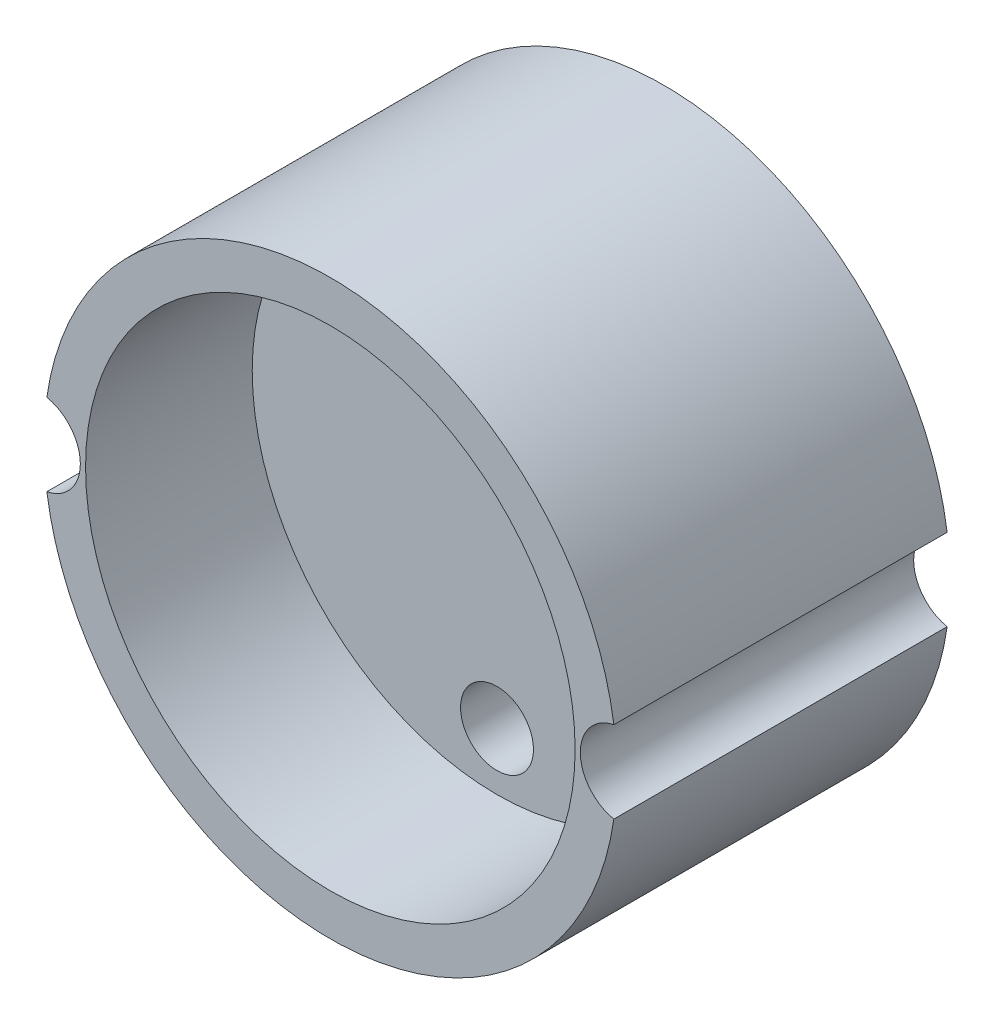
ISO-10303-21;
HEADER;
FILE_DESCRIPTION(('STEP AP214'),'2;1');
FILE_NAME('part.step','',(''),(''),'','','');
FILE_SCHEMA(('AUTOMOTIVE_DESIGN { 1 0 10303 214 1 1 1 1 }'));
ENDSEC;
DATA;
#1=APPLICATION_CONTEXT('core data for automotive mechanical design processes');
#2=APPLICATION_PROTOCOL_DEFINITION('international standard','automotive_design',2000,#1);
#3=PRODUCT_CONTEXT('',#1,'mechanical');
#4=PRODUCT('Part','Part','',(#3));
#5=PRODUCT_RELATED_PRODUCT_CATEGORY('part','',(#4));
#6=PRODUCT_DEFINITION_FORMATION('','',#4);
#7=PRODUCT_DEFINITION_CONTEXT('part definition',#1,'design');
#8=PRODUCT_DEFINITION('design','',#6,#7);
#9=PRODUCT_DEFINITION_SHAPE('','',#8);
#10=(LENGTH_UNIT() NAMED_UNIT(*) SI_UNIT(.MILLI.,.METRE.));
#11=(NAMED_UNIT(*) PLANE_ANGLE_UNIT() SI_UNIT($,.RADIAN.));
#12=(NAMED_UNIT(*) SI_UNIT($,.STERADIAN.) SOLID_ANGLE_UNIT());
#13=UNCERTAINTY_MEASURE_WITH_UNIT(LENGTH_MEASURE(1.E-05),#10,'distance_accuracy_value','');
#14=(GEOMETRIC_REPRESENTATION_CONTEXT(3) GLOBAL_UNCERTAINTY_ASSIGNED_CONTEXT((#13)) GLOBAL_UNIT_ASSIGNED_CONTEXT((#10,
#11,#12)) REPRESENTATION_CONTEXT('',''));
#15=CARTESIAN_POINT('',(0.,0.,0.));
#16=DIRECTION('',(0.,0.,1.));
#17=DIRECTION('',(1.,0.,0.));
#18=AXIS2_PLACEMENT_3D('',#15,#16,#17);
#19=CARTESIAN_POINT('',(0.,0.,16.));
#20=DIRECTION('',(0.,0.,1.));
#21=DIRECTION('',(1.,0.,0.));
#22=AXIS2_PLACEMENT_3D('',#19,#20,#21);
#23=PLANE('',#22);
#24=CARTESIAN_POINT('',(0.,0.,16.));
#25=DIRECTION('',(0.,0.,1.));
#26=DIRECTION('',(1.,0.,0.));
#27=AXIS2_PLACEMENT_3D('',#24,#25,#26);
#28=CIRCLE('',#27,11.75);
#29=CARTESIAN_POINT('',(11.75,0.,16.));
#30=VERTEX_POINT('',#29);
#31=EDGE_CURVE('E106',#30,#30,#28,.T.);
#32=ORIENTED_EDGE('',*,*,#31,.F.);
#33=EDGE_LOOP('',(#32));
#34=FACE_BOUND('',#33,.T.);
#35=CARTESIAN_POINT('',(14.,0.,16.));
#36=DIRECTION('',(0.,0.,1.));
#37=DIRECTION('',(1.,0.,0.));
#38=AXIS2_PLACEMENT_3D('',#35,#36,#37);
#39=CIRCLE('',#38,2.);
#40=CARTESIAN_POINT('',(13.609375,1.9614821205851,16.));
#41=VERTEX_POINT('',#40);
#42=CARTESIAN_POINT('',(13.609375,-1.96148212058509,16.));
#43=VERTEX_POINT('',#42);
#44=EDGE_CURVE('E79',#41,#43,#39,.T.);
#45=ORIENTED_EDGE('',*,*,#44,.F.);
#46=CARTESIAN_POINT('',(0.,0.,16.));
#47=DIRECTION('',(0.,0.,1.));
#48=DIRECTION('',(1.,0.,0.));
#49=AXIS2_PLACEMENT_3D('',#46,#47,#48);
#50=CIRCLE('',#49,13.75);
#51=CARTESIAN_POINT('',(-13.609375,1.9614821205851,16.));
#52=VERTEX_POINT('',#51);
#53=EDGE_CURVE('E91',#41,#52,#50,.T.);
#54=ORIENTED_EDGE('',*,*,#53,.T.);
#55=CARTESIAN_POINT('',(-14.,0.,16.));
#56=DIRECTION('',(0.,0.,-1.));
#57=DIRECTION('',(-1.,0.,0.));
#58=AXIS2_PLACEMENT_3D('',#55,#56,#57);
#59=CIRCLE('',#58,2.);
#60=CARTESIAN_POINT('',(-13.609375,-1.96148212058509,16.));
#61=VERTEX_POINT('',#60);
#62=EDGE_CURVE('E112',#52,#61,#59,.T.);
#63=ORIENTED_EDGE('',*,*,#62,.T.);
#64=EDGE_CURVE('E92',#61,#43,#50,.T.);
#65=ORIENTED_EDGE('',*,*,#64,.T.);
#66=EDGE_LOOP('',(#45,#54,#63,#65));
#67=FACE_BOUND('',#66,.T.);
#68=ADVANCED_FACE('F39',(#34,#67),#23,.T.);
#69=CARTESIAN_POINT('',(0.,0.,0.));
#70=DIRECTION('',(0.,0.,1.));
#71=DIRECTION('',(1.,0.,0.));
#72=AXIS2_PLACEMENT_3D('',#69,#70,#71);
#73=PLANE('',#72);
#74=CARTESIAN_POINT('',(0.,9.,0.));
#75=DIRECTION('',(0.,0.,-1.));
#76=DIRECTION('',(-1.,0.,0.));
#77=AXIS2_PLACEMENT_3D('',#74,#75,#76);
#78=CIRCLE('',#77,1.75);
#79=CARTESIAN_POINT('',(-1.75,9.,0.));
#80=VERTEX_POINT('',#79);
#81=EDGE_CURVE('E119',#80,#80,#78,.T.);
#82=ORIENTED_EDGE('',*,*,#81,.F.);
#83=EDGE_LOOP('',(#82));
#84=FACE_BOUND('',#83,.T.);
#85=CARTESIAN_POINT('',(0.,-9.,0.));
#86=DIRECTION('',(0.,0.,-1.));
#87=DIRECTION('',(-1.,0.,0.));
#88=AXIS2_PLACEMENT_3D('',#85,#86,#87);
#89=CIRCLE('',#88,1.75);
#90=CARTESIAN_POINT('',(-1.75,-9.,0.));
#91=VERTEX_POINT('',#90);
#92=EDGE_CURVE('E102',#91,#91,#89,.T.);
#93=ORIENTED_EDGE('',*,*,#92,.F.);
#94=EDGE_LOOP('',(#93));
#95=FACE_BOUND('',#94,.T.);
#96=CARTESIAN_POINT('',(0.,0.,0.));
#97=DIRECTION('',(0.,0.,1.));
#98=DIRECTION('',(1.,0.,0.));
#99=AXIS2_PLACEMENT_3D('',#96,#97,#98);
#100=CIRCLE('',#99,13.75);
#101=CARTESIAN_POINT('',(13.609375,1.9614821205851,0.));
#102=VERTEX_POINT('',#101);
#103=CARTESIAN_POINT('',(-13.609375,1.9614821205851,0.));
#104=VERTEX_POINT('',#103);
#105=EDGE_CURVE('E89',#102,#104,#100,.T.);
#106=ORIENTED_EDGE('',*,*,#105,.F.);
#107=CARTESIAN_POINT('',(14.,0.,0.));
#108=DIRECTION('',(0.,0.,1.));
#109=DIRECTION('',(1.,0.,0.));
#110=AXIS2_PLACEMENT_3D('',#107,#108,#109);
#111=CIRCLE('',#110,2.);
#112=CARTESIAN_POINT('',(13.609375,-1.96148212058509,0.));
#113=VERTEX_POINT('',#112);
#114=EDGE_CURVE('E52',#102,#113,#111,.T.);
#115=ORIENTED_EDGE('',*,*,#114,.T.);
#116=CARTESIAN_POINT('',(-13.609375,-1.96148212058511,0.));
#117=VERTEX_POINT('',#116);
#118=EDGE_CURVE('E90',#117,#113,#100,.T.);
#119=ORIENTED_EDGE('',*,*,#118,.F.);
#120=CARTESIAN_POINT('',(-14.,0.,0.));
#121=DIRECTION('',(0.,0.,-1.));
#122=DIRECTION('',(-1.,0.,0.));
#123=AXIS2_PLACEMENT_3D('',#120,#121,#122);
#124=CIRCLE('',#123,2.);
#125=EDGE_CURVE('E61',#104,#117,#124,.T.);
#126=ORIENTED_EDGE('',*,*,#125,.F.);
#127=EDGE_LOOP('',(#106,#115,#119,#126));
#128=FACE_BOUND('',#127,.T.);
#129=ADVANCED_FACE('F86',(#84,#95,#128),#73,.F.);
#130=CARTESIAN_POINT('',(0.,0.,16.));
#131=DIRECTION('',(0.,0.,-1.));
#132=DIRECTION('',(-1.,0.,0.));
#133=AXIS2_PLACEMENT_3D('',#130,#131,#132);
#134=CYLINDRICAL_SURFACE('',#133,13.75);
#135=DIRECTION('',(0.,0.,-1.));
#136=VECTOR('',#135,1.);
#137=CARTESIAN_POINT('',(13.609375,-1.96148212058509,8.));
#138=LINE('',#137,#136);
#139=EDGE_CURVE('E11',#43,#113,#138,.T.);
#140=ORIENTED_EDGE('',*,*,#139,.F.);
#141=ORIENTED_EDGE('',*,*,#64,.F.);
#142=DIRECTION('',(0.,0.,-1.));
#143=VECTOR('',#142,1.);
#144=CARTESIAN_POINT('',(-13.609375,-1.96148212058509,8.));
#145=LINE('',#144,#143);
#146=EDGE_CURVE('E95',#61,#117,#145,.T.);
#147=ORIENTED_EDGE('',*,*,#146,.T.);
#148=ORIENTED_EDGE('',*,*,#118,.T.);
#149=EDGE_LOOP('',(#140,#141,#147,#148));
#150=FACE_BOUND('',#149,.T.);
#151=ADVANCED_FACE('F41',(#150),#134,.T.);
#152=DIRECTION('',(0.,0.,-1.));
#153=VECTOR('',#152,1.);
#154=CARTESIAN_POINT('',(13.609375,1.9614821205851,8.));
#155=LINE('',#154,#153);
#156=EDGE_CURVE('E50',#102,#41,#155,.F.);
#157=ORIENTED_EDGE('',*,*,#156,.F.);
#158=ORIENTED_EDGE('',*,*,#105,.T.);
#159=DIRECTION('',(0.,0.,-1.));
#160=VECTOR('',#159,1.);
#161=CARTESIAN_POINT('',(-13.609375,1.9614821205851,8.));
#162=LINE('',#161,#160);
#163=EDGE_CURVE('E111',#104,#52,#162,.F.);
#164=ORIENTED_EDGE('',*,*,#163,.T.);
#165=ORIENTED_EDGE('',*,*,#53,.F.);
#166=EDGE_LOOP('',(#157,#158,#164,#165));
#167=FACE_BOUND('',#166,.T.);
#168=ADVANCED_FACE('F142',(#167),#134,.T.);
#169=CARTESIAN_POINT('',(0.,0.,8.));
#170=DIRECTION('',(0.,0.,1.));
#171=DIRECTION('',(1.,0.,0.));
#172=AXIS2_PLACEMENT_3D('',#169,#170,#171);
#173=CYLINDRICAL_SURFACE('',#172,11.75);
#174=CARTESIAN_POINT('',(0.,0.,8.));
#175=DIRECTION('',(0.,0.,1.));
#176=DIRECTION('',(1.,0.,0.));
#177=AXIS2_PLACEMENT_3D('',#174,#175,#176);
#178=CIRCLE('',#177,11.75);
#179=CARTESIAN_POINT('',(11.75,0.,8.));
#180=VERTEX_POINT('',#179);
#181=EDGE_CURVE('E100',#180,#180,#178,.T.);
#182=ORIENTED_EDGE('',*,*,#181,.F.);
#183=EDGE_LOOP('',(#182));
#184=FACE_BOUND('',#183,.T.);
#185=ORIENTED_EDGE('',*,*,#31,.T.);
#186=EDGE_LOOP('',(#185));
#187=FACE_BOUND('',#186,.T.);
#188=ADVANCED_FACE('F129',(#184,#187),#173,.F.);
#189=CARTESIAN_POINT('',(0.,0.,8.));
#190=DIRECTION('',(0.,0.,1.));
#191=DIRECTION('',(1.,0.,0.));
#192=AXIS2_PLACEMENT_3D('',#189,#190,#191);
#193=PLANE('',#192);
#194=CARTESIAN_POINT('',(0.,-9.,8.));
#195=DIRECTION('',(0.,0.,1.));
#196=DIRECTION('',(1.,0.,0.));
#197=AXIS2_PLACEMENT_3D('',#194,#195,#196);
#198=CIRCLE('',#197,1.75);
#199=CARTESIAN_POINT('',(1.75,-9.,8.));
#200=VERTEX_POINT('',#199);
#201=EDGE_CURVE('E103',#200,#200,#198,.T.);
#202=ORIENTED_EDGE('',*,*,#201,.F.);
#203=EDGE_LOOP('',(#202));
#204=FACE_BOUND('',#203,.T.);
#205=CARTESIAN_POINT('',(0.,9.,8.));
#206=DIRECTION('',(0.,0.,1.));
#207=DIRECTION('',(1.,0.,0.));
#208=AXIS2_PLACEMENT_3D('',#205,#206,#207);
#209=CIRCLE('',#208,1.75);
#210=CARTESIAN_POINT('',(1.75,9.,8.));
#211=VERTEX_POINT('',#210);
#212=EDGE_CURVE('E99',#211,#211,#209,.T.);
#213=ORIENTED_EDGE('',*,*,#212,.F.);
#214=EDGE_LOOP('',(#213));
#215=FACE_BOUND('',#214,.T.);
#216=ORIENTED_EDGE('',*,*,#181,.T.);
#217=EDGE_LOOP('',(#216));
#218=FACE_BOUND('',#217,.T.);
#219=ADVANCED_FACE('F143',(#204,#215,#218),#193,.T.);
#220=CARTESIAN_POINT('',(0.,9.,16.));
#221=DIRECTION('',(0.,0.,-1.));
#222=DIRECTION('',(-1.,0.,0.));
#223=AXIS2_PLACEMENT_3D('',#220,#221,#222);
#224=CYLINDRICAL_SURFACE('',#223,1.75);
#225=ORIENTED_EDGE('',*,*,#212,.T.);
#226=EDGE_LOOP('',(#225));
#227=FACE_BOUND('',#226,.T.);
#228=ORIENTED_EDGE('',*,*,#81,.T.);
#229=EDGE_LOOP('',(#228));
#230=FACE_BOUND('',#229,.T.);
#231=ADVANCED_FACE('F148',(#227,#230),#224,.F.);
#232=CARTESIAN_POINT('',(0.,-9.,16.));
#233=DIRECTION('',(0.,0.,-1.));
#234=DIRECTION('',(-1.,0.,0.));
#235=AXIS2_PLACEMENT_3D('',#232,#233,#234);
#236=CYLINDRICAL_SURFACE('',#235,1.75);
#237=ORIENTED_EDGE('',*,*,#201,.T.);
#238=EDGE_LOOP('',(#237));
#239=FACE_BOUND('',#238,.T.);
#240=ORIENTED_EDGE('',*,*,#92,.T.);
#241=EDGE_LOOP('',(#240));
#242=FACE_BOUND('',#241,.T.);
#243=ADVANCED_FACE('F147',(#239,#242),#236,.F.);
#244=CARTESIAN_POINT('',(-14.,0.,16.));
#245=DIRECTION('',(0.,0.,-1.));
#246=DIRECTION('',(-1.,0.,0.));
#247=AXIS2_PLACEMENT_3D('',#244,#245,#246);
#248=CYLINDRICAL_SURFACE('',#247,2.);
#249=ORIENTED_EDGE('',*,*,#125,.T.);
#250=ORIENTED_EDGE('',*,*,#146,.F.);
#251=ORIENTED_EDGE('',*,*,#62,.F.);
#252=ORIENTED_EDGE('',*,*,#163,.F.);
#253=EDGE_LOOP('',(#249,#250,#251,#252));
#254=FACE_BOUND('',#253,.T.);
#255=ADVANCED_FACE('F152',(#254),#248,.F.);
#256=CARTESIAN_POINT('',(14.,0.,16.));
#257=DIRECTION('',(0.,0.,-1.));
#258=DIRECTION('',(-1.,0.,0.));
#259=AXIS2_PLACEMENT_3D('',#256,#257,#258);
#260=CYLINDRICAL_SURFACE('',#259,2.);
#261=ORIENTED_EDGE('',*,*,#139,.T.);
#262=ORIENTED_EDGE('',*,*,#114,.F.);
#263=ORIENTED_EDGE('',*,*,#156,.T.);
#264=ORIENTED_EDGE('',*,*,#44,.T.);
#265=EDGE_LOOP('',(#261,#262,#263,#264));
#266=FACE_BOUND('',#265,.T.);
#267=ADVANCED_FACE('F77',(#266),#260,.F.);
#268=CLOSED_SHELL('',(#68,#129,#151,#168,#188,#219,#231,#243,#255,#267));
#269=MANIFOLD_SOLID_BREP('B2',#268);
#270=ADVANCED_BREP_SHAPE_REPRESENTATION('',(#18,#269),#14);
#271=SHAPE_DEFINITION_REPRESENTATION(#9,#270);
ENDSEC;
END-ISO-10303-21;
